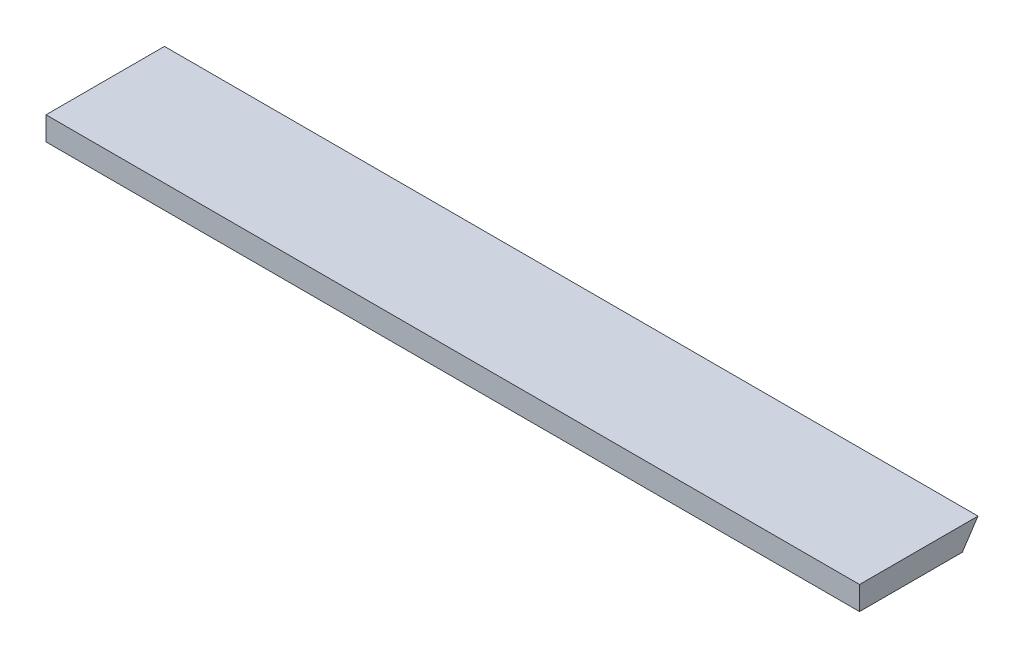
ISO-10303-21;
HEADER;
FILE_DESCRIPTION(('STEP AP214'),'2;1');
FILE_NAME('part.step','',(''),(''),'','','');
FILE_SCHEMA(('AUTOMOTIVE_DESIGN { 1 0 10303 214 1 1 1 1 }'));
ENDSEC;
DATA;
#1=APPLICATION_CONTEXT('core data for automotive mechanical design processes');
#2=APPLICATION_PROTOCOL_DEFINITION('international standard','automotive_design',2000,#1);
#3=PRODUCT_CONTEXT('',#1,'mechanical');
#4=PRODUCT('Part','Part','',(#3));
#5=PRODUCT_RELATED_PRODUCT_CATEGORY('part','',(#4));
#6=PRODUCT_DEFINITION_FORMATION('','',#4);
#7=PRODUCT_DEFINITION_CONTEXT('part definition',#1,'design');
#8=PRODUCT_DEFINITION('design','',#6,#7);
#9=PRODUCT_DEFINITION_SHAPE('','',#8);
#10=(LENGTH_UNIT() NAMED_UNIT(*) SI_UNIT(.MILLI.,.METRE.));
#11=(NAMED_UNIT(*) PLANE_ANGLE_UNIT() SI_UNIT($,.RADIAN.));
#12=(NAMED_UNIT(*) SI_UNIT($,.STERADIAN.) SOLID_ANGLE_UNIT());
#13=UNCERTAINTY_MEASURE_WITH_UNIT(LENGTH_MEASURE(1.E-05),#10,'distance_accuracy_value','');
#14=(GEOMETRIC_REPRESENTATION_CONTEXT(3) GLOBAL_UNCERTAINTY_ASSIGNED_CONTEXT((#13)) GLOBAL_UNIT_ASSIGNED_CONTEXT((#10,
#11,#12)) REPRESENTATION_CONTEXT('',''));
#15=CARTESIAN_POINT('',(0.,0.,0.));
#16=DIRECTION('',(0.,0.,1.));
#17=DIRECTION('',(1.,0.,0.));
#18=AXIS2_PLACEMENT_3D('',#15,#16,#17);
#19=CARTESIAN_POINT('',(-93.2729530739432,8.,-5.19128662181619));
#20=DIRECTION('',(1.,0.,0.));
#21=DIRECTION('',(0.,0.,-1.));
#22=AXIS2_PLACEMENT_3D('',#19,#20,#21);
#23=PLANE('',#22);
#24=DIRECTION('',(0.,0.,1.));
#25=VECTOR('',#24,1.);
#26=CARTESIAN_POINT('',(-93.2729530739432,0.,-5.19128662181619));
#27=LINE('',#26,#25);
#28=CARTESIAN_POINT('',(-93.2729530739432,0.,-40.1912866218162));
#29=VERTEX_POINT('',#28);
#30=CARTESIAN_POINT('',(-93.2729530739432,0.,-5.19128662181619));
#31=VERTEX_POINT('',#30);
#32=EDGE_CURVE('E79',#29,#31,#27,.T.);
#33=ORIENTED_EDGE('',*,*,#32,.T.);
#34=DIRECTION('',(0.,-1.,0.));
#35=VECTOR('',#34,1.);
#36=CARTESIAN_POINT('',(-93.2729530739432,8.,-5.19128662181619));
#37=LINE('',#36,#35);
#38=CARTESIAN_POINT('',(-93.2729530739432,8.,-5.19128662181619));
#39=VERTEX_POINT('',#38);
#40=EDGE_CURVE('E11',#39,#31,#37,.T.);
#41=ORIENTED_EDGE('',*,*,#40,.F.);
#42=DIRECTION('',(0.,0.,1.));
#43=VECTOR('',#42,1.);
#44=CARTESIAN_POINT('',(-93.2729530739432,8.,-5.19128662181619));
#45=LINE('',#44,#43);
#46=CARTESIAN_POINT('',(-93.2729530739432,8.00000000000001,-45.5246063363523));
#47=VERTEX_POINT('',#46);
#48=EDGE_CURVE('E101',#47,#39,#45,.T.);
#49=ORIENTED_EDGE('',*,*,#48,.F.);
#50=DIRECTION('',(0.,-0.832050948079561,0.554699215611401));
#51=VECTOR('',#50,1.);
#52=CARTESIAN_POINT('',(-93.2729530739432,0.,-40.1912866218162));
#53=LINE('',#52,#51);
#54=EDGE_CURVE('E97',#47,#29,#53,.T.);
#55=ORIENTED_EDGE('',*,*,#54,.T.);
#56=EDGE_LOOP('',(#33,#41,#49,#55));
#57=FACE_BOUND('',#56,.T.);
#58=ADVANCED_FACE('F45',(#57),#23,.F.);
#59=CARTESIAN_POINT('',(-93.2729530739432,8.,-5.19128662181619));
#60=DIRECTION('',(0.,0.,-1.));
#61=DIRECTION('',(-1.,0.,0.));
#62=AXIS2_PLACEMENT_3D('',#59,#60,#61);
#63=PLANE('',#62);
#64=DIRECTION('',(1.,0.,0.));
#65=VECTOR('',#64,1.);
#66=CARTESIAN_POINT('',(-93.2729530739432,0.,-5.19128662181619));
#67=LINE('',#66,#65);
#68=CARTESIAN_POINT('',(183.727046926057,0.,-5.19128662181619));
#69=VERTEX_POINT('',#68);
#70=EDGE_CURVE('E73',#31,#69,#67,.T.);
#71=ORIENTED_EDGE('',*,*,#70,.T.);
#72=DIRECTION('',(0.,-1.,0.));
#73=VECTOR('',#72,1.);
#74=CARTESIAN_POINT('',(183.727046926057,8.,-5.19128662181619));
#75=LINE('',#74,#73);
#76=CARTESIAN_POINT('',(183.727046926057,8.,-5.19128662181619));
#77=VERTEX_POINT('',#76);
#78=EDGE_CURVE('E54',#77,#69,#75,.T.);
#79=ORIENTED_EDGE('',*,*,#78,.F.);
#80=DIRECTION('',(1.,0.,0.));
#81=VECTOR('',#80,1.);
#82=CARTESIAN_POINT('',(-93.2729530739432,8.,-5.19128662181619));
#83=LINE('',#82,#81);
#84=EDGE_CURVE('E62',#39,#77,#83,.T.);
#85=ORIENTED_EDGE('',*,*,#84,.F.);
#86=ORIENTED_EDGE('',*,*,#40,.T.);
#87=EDGE_LOOP('',(#71,#79,#85,#86));
#88=FACE_BOUND('',#87,.T.);
#89=ADVANCED_FACE('F127',(#88),#63,.F.);
#90=CARTESIAN_POINT('',(183.727046926057,8.,-40.1912866218162));
#91=DIRECTION('',(-1.,0.,0.));
#92=DIRECTION('',(0.,0.,1.));
#93=AXIS2_PLACEMENT_3D('',#90,#91,#92);
#94=PLANE('',#93);
#95=DIRECTION('',(0.,0.,-1.));
#96=VECTOR('',#95,1.);
#97=CARTESIAN_POINT('',(183.727046926057,0.,-40.1912866218162));
#98=LINE('',#97,#96);
#99=CARTESIAN_POINT('',(183.727046926057,0.,-40.1912866218162));
#100=VERTEX_POINT('',#99);
#101=EDGE_CURVE('E102',#69,#100,#98,.T.);
#102=ORIENTED_EDGE('',*,*,#101,.T.);
#103=DIRECTION('',(0.,-0.832050948079561,0.554699215611401));
#104=VECTOR('',#103,1.);
#105=CARTESIAN_POINT('',(183.727046926057,0.,-40.1912866218162));
#106=LINE('',#105,#104);
#107=CARTESIAN_POINT('',(183.727046926057,8.00000000000001,-45.5246063363523));
#108=VERTEX_POINT('',#107);
#109=EDGE_CURVE('E99',#108,#100,#106,.T.);
#110=ORIENTED_EDGE('',*,*,#109,.F.);
#111=DIRECTION('',(0.,0.,-1.));
#112=VECTOR('',#111,1.);
#113=CARTESIAN_POINT('',(183.727046926057,8.,-40.1912866218162));
#114=LINE('',#113,#112);
#115=EDGE_CURVE('E117',#77,#108,#114,.T.);
#116=ORIENTED_EDGE('',*,*,#115,.F.);
#117=ORIENTED_EDGE('',*,*,#78,.T.);
#118=EDGE_LOOP('',(#102,#110,#116,#117));
#119=FACE_BOUND('',#118,.T.);
#120=ADVANCED_FACE('F126',(#119),#94,.F.);
#121=CARTESIAN_POINT('',(0.,8.,0.));
#122=DIRECTION('',(0.,-1.,0.));
#123=DIRECTION('',(0.,0.,-1.));
#124=AXIS2_PLACEMENT_3D('',#121,#122,#123);
#125=PLANE('',#124);
#126=ORIENTED_EDGE('',*,*,#48,.T.);
#127=ORIENTED_EDGE('',*,*,#84,.T.);
#128=ORIENTED_EDGE('',*,*,#115,.T.);
#129=DIRECTION('',(-1.,0.,0.));
#130=VECTOR('',#129,1.);
#131=CARTESIAN_POINT('',(183.727046926057,8.00000000000001,-45.5246063363523));
#132=LINE('',#131,#130);
#133=EDGE_CURVE('E89',#108,#47,#132,.T.);
#134=ORIENTED_EDGE('',*,*,#133,.T.);
#135=EDGE_LOOP('',(#126,#127,#128,#134));
#136=FACE_BOUND('',#135,.T.);
#137=ADVANCED_FACE('F128',(#136),#125,.F.);
#138=CARTESIAN_POINT('',(0.,0.,0.));
#139=DIRECTION('',(0.,-1.,0.));
#140=DIRECTION('',(0.,0.,-1.));
#141=AXIS2_PLACEMENT_3D('',#138,#139,#140);
#142=PLANE('',#141);
#143=ORIENTED_EDGE('',*,*,#32,.F.);
#144=DIRECTION('',(-1.,0.,0.));
#145=VECTOR('',#144,1.);
#146=CARTESIAN_POINT('',(-93.2729530739432,0.,-40.1912866218162));
#147=LINE('',#146,#145);
#148=EDGE_CURVE('E83',#100,#29,#147,.T.);
#149=ORIENTED_EDGE('',*,*,#148,.F.);
#150=ORIENTED_EDGE('',*,*,#101,.F.);
#151=ORIENTED_EDGE('',*,*,#70,.F.);
#152=EDGE_LOOP('',(#143,#149,#150,#151));
#153=FACE_BOUND('',#152,.T.);
#154=ADVANCED_FACE('F81',(#153),#142,.T.);
#155=CARTESIAN_POINT('',(183.727046926057,0.,-40.1912866218162));
#156=DIRECTION('',(0.,-0.554699215611401,-0.832050948079561));
#157=DIRECTION('',(0.,0.832050948079561,-0.554699215611401));
#158=AXIS2_PLACEMENT_3D('',#155,#156,#157);
#159=PLANE('',#158);
#160=ORIENTED_EDGE('',*,*,#54,.F.);
#161=ORIENTED_EDGE('',*,*,#133,.F.);
#162=ORIENTED_EDGE('',*,*,#109,.T.);
#163=ORIENTED_EDGE('',*,*,#148,.T.);
#164=EDGE_LOOP('',(#160,#161,#162,#163));
#165=FACE_BOUND('',#164,.T.);
#166=ADVANCED_FACE('F94',(#165),#159,.T.);
#167=CLOSED_SHELL('',(#58,#89,#120,#137,#154,#166));
#168=MANIFOLD_SOLID_BREP('B2',#167);
#169=ADVANCED_BREP_SHAPE_REPRESENTATION('',(#18,#168),#14);
#170=SHAPE_DEFINITION_REPRESENTATION(#9,#169);
ENDSEC;
END-ISO-10303-21;
